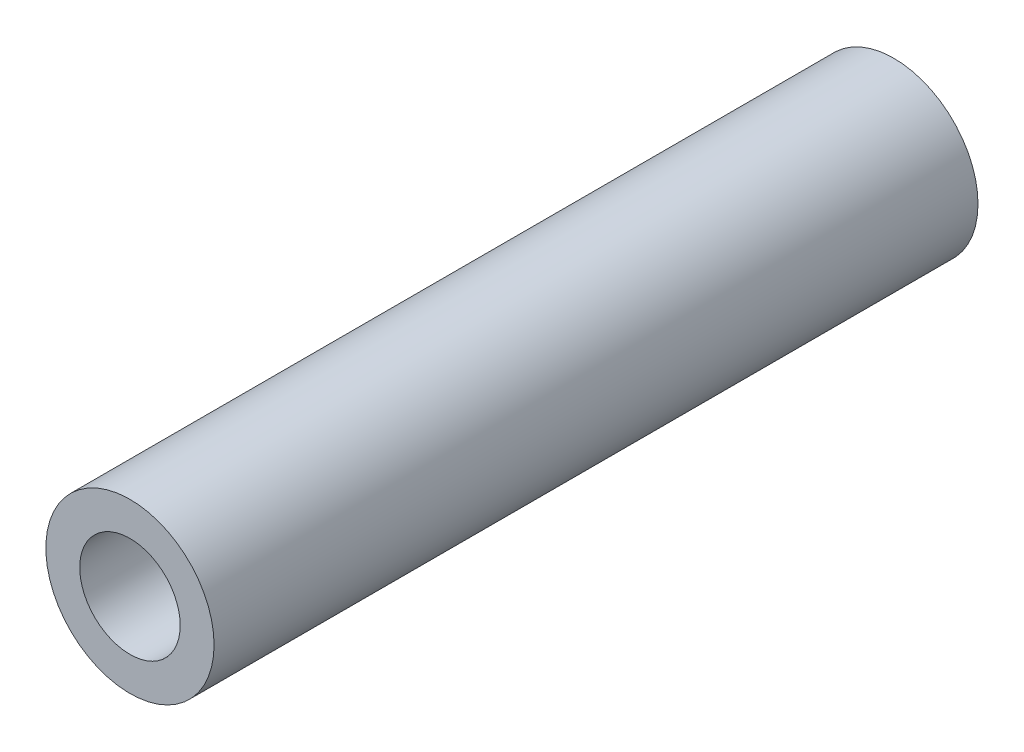
ISO-10303-21;
HEADER;
FILE_DESCRIPTION(('STEP AP214'),'2;1');
FILE_NAME('part.step','',(''),(''),'','','');
FILE_SCHEMA(('AUTOMOTIVE_DESIGN { 1 0 10303 214 1 1 1 1 }'));
ENDSEC;
DATA;
#1=APPLICATION_CONTEXT('core data for automotive mechanical design processes');
#2=APPLICATION_PROTOCOL_DEFINITION('international standard','automotive_design',2000,#1);
#3=PRODUCT_CONTEXT('',#1,'mechanical');
#4=PRODUCT('Part','Part','',(#3));
#5=PRODUCT_RELATED_PRODUCT_CATEGORY('part','',(#4));
#6=PRODUCT_DEFINITION_FORMATION('','',#4);
#7=PRODUCT_DEFINITION_CONTEXT('part definition',#1,'design');
#8=PRODUCT_DEFINITION('design','',#6,#7);
#9=PRODUCT_DEFINITION_SHAPE('','',#8);
#10=(LENGTH_UNIT() NAMED_UNIT(*) SI_UNIT(.MILLI.,.METRE.));
#11=(NAMED_UNIT(*) PLANE_ANGLE_UNIT() SI_UNIT($,.RADIAN.));
#12=(NAMED_UNIT(*) SI_UNIT($,.STERADIAN.) SOLID_ANGLE_UNIT());
#13=UNCERTAINTY_MEASURE_WITH_UNIT(LENGTH_MEASURE(1.E-05),#10,'distance_accuracy_value','');
#14=(GEOMETRIC_REPRESENTATION_CONTEXT(3) GLOBAL_UNCERTAINTY_ASSIGNED_CONTEXT((#13)) GLOBAL_UNIT_ASSIGNED_CONTEXT((#10,
#11,#12)) REPRESENTATION_CONTEXT('',''));
#15=CARTESIAN_POINT('',(0.,0.,0.));
#16=DIRECTION('',(0.,0.,1.));
#17=DIRECTION('',(1.,0.,0.));
#18=AXIS2_PLACEMENT_3D('',#15,#16,#17);
#19=CARTESIAN_POINT('',(0.,0.,0.));
#20=DIRECTION('',(0.,0.,1.));
#21=DIRECTION('',(1.,0.,0.));
#22=AXIS2_PLACEMENT_3D('',#19,#20,#21);
#23=CYLINDRICAL_SURFACE('',#22,25.5293751023041);
#24=CARTESIAN_POINT('',(0.,0.,0.));
#25=DIRECTION('',(0.,0.,1.));
#26=DIRECTION('',(1.,0.,0.));
#27=AXIS2_PLACEMENT_3D('',#24,#25,#26);
#28=CIRCLE('',#27,25.5293751023041);
#29=CARTESIAN_POINT('',(25.5293751023041,0.,0.));
#30=VERTEX_POINT('',#29);
#31=EDGE_CURVE('E34',#30,#30,#28,.F.);
#32=ORIENTED_EDGE('',*,*,#31,.T.);
#33=EDGE_LOOP('',(#32));
#34=FACE_BOUND('',#33,.T.);
#35=CARTESIAN_POINT('',(1.49734029225406E-13,0.,388.187372741407));
#36=DIRECTION('',(0.,0.,1.));
#37=DIRECTION('',(1.,0.,0.));
#38=AXIS2_PLACEMENT_3D('',#35,#36,#37);
#39=CIRCLE('',#38,25.5293751023041);
#40=CARTESIAN_POINT('',(25.5293751023043,0.,388.187372741407));
#41=VERTEX_POINT('',#40);
#42=EDGE_CURVE('E45',#41,#41,#39,.T.);
#43=ORIENTED_EDGE('',*,*,#42,.T.);
#44=EDGE_LOOP('',(#43));
#45=FACE_BOUND('',#44,.T.);
#46=ADVANCED_FACE('F31',(#34,#45),#23,.F.);
#47=CARTESIAN_POINT('',(0.,0.,0.));
#48=DIRECTION('',(0.,0.,1.));
#49=DIRECTION('',(0.,-1.,0.));
#50=AXIS2_PLACEMENT_3D('',#47,#48,#49);
#51=PLANE('',#50);
#52=CARTESIAN_POINT('',(0.,0.,0.));
#53=DIRECTION('',(0.,0.,1.));
#54=DIRECTION('',(1.,0.,0.));
#55=AXIS2_PLACEMENT_3D('',#52,#53,#54);
#56=CIRCLE('',#55,42.7457435045486);
#57=CARTESIAN_POINT('',(42.7457435045486,0.,0.));
#58=VERTEX_POINT('',#57);
#59=EDGE_CURVE('E10',#58,#58,#56,.T.);
#60=ORIENTED_EDGE('',*,*,#59,.F.);
#61=EDGE_LOOP('',(#60));
#62=FACE_BOUND('',#61,.T.);
#63=ORIENTED_EDGE('',*,*,#31,.F.);
#64=EDGE_LOOP('',(#63));
#65=FACE_BOUND('',#64,.T.);
#66=ADVANCED_FACE('F58',(#62,#65),#51,.F.);
#67=CARTESIAN_POINT('',(0.,0.,0.));
#68=DIRECTION('',(0.,0.,1.));
#69=DIRECTION('',(1.,0.,0.));
#70=AXIS2_PLACEMENT_3D('',#67,#68,#69);
#71=CYLINDRICAL_SURFACE('',#70,42.7457435045486);
#72=ORIENTED_EDGE('',*,*,#59,.T.);
#73=EDGE_LOOP('',(#72));
#74=FACE_BOUND('',#73,.T.);
#75=CARTESIAN_POINT('',(1.49734029225406E-13,0.,388.187372741407));
#76=DIRECTION('',(0.,0.,1.));
#77=DIRECTION('',(1.,0.,0.));
#78=AXIS2_PLACEMENT_3D('',#75,#76,#77);
#79=CIRCLE('',#78,42.7457435045486);
#80=CARTESIAN_POINT('',(42.7457435045488,0.,388.187372741407));
#81=VERTEX_POINT('',#80);
#82=EDGE_CURVE('E41',#81,#81,#79,.T.);
#83=ORIENTED_EDGE('',*,*,#82,.F.);
#84=EDGE_LOOP('',(#83));
#85=FACE_BOUND('',#84,.T.);
#86=ADVANCED_FACE('F52',(#74,#85),#71,.T.);
#87=CARTESIAN_POINT('',(1.49734029225406E-13,0.,388.187372741407));
#88=DIRECTION('',(0.,0.,1.));
#89=DIRECTION('',(1.,0.,0.));
#90=AXIS2_PLACEMENT_3D('',#87,#88,#89);
#91=PLANE('',#90);
#92=ORIENTED_EDGE('',*,*,#82,.T.);
#93=EDGE_LOOP('',(#92));
#94=FACE_BOUND('',#93,.T.);
#95=ORIENTED_EDGE('',*,*,#42,.F.);
#96=EDGE_LOOP('',(#95));
#97=FACE_BOUND('',#96,.T.);
#98=ADVANCED_FACE('F50',(#94,#97),#91,.T.);
#99=CLOSED_SHELL('',(#46,#66,#86,#98));
#100=MANIFOLD_SOLID_BREP('B2',#99);
#101=ADVANCED_BREP_SHAPE_REPRESENTATION('',(#18,#100),#14);
#102=SHAPE_DEFINITION_REPRESENTATION(#9,#101);
ENDSEC;
END-ISO-10303-21;
